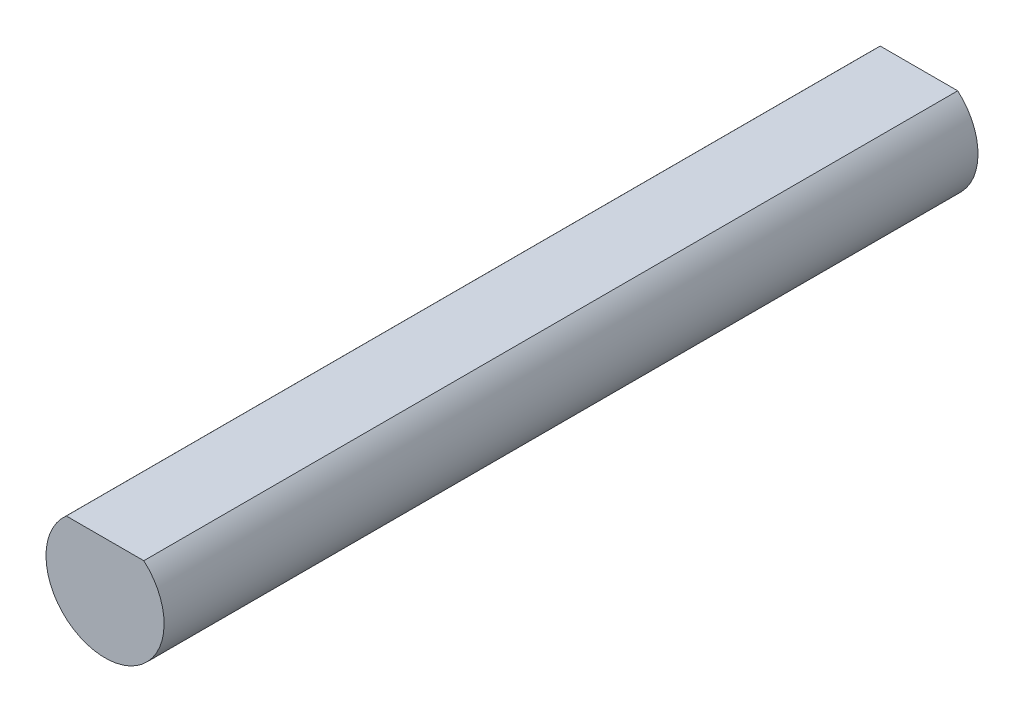
ISO-10303-21;
HEADER;
FILE_DESCRIPTION(('STEP AP214'),'2;1');
FILE_NAME('part.step','',(''),(''),'','','');
FILE_SCHEMA(('AUTOMOTIVE_DESIGN { 1 0 10303 214 1 1 1 1 }'));
ENDSEC;
DATA;
#1=APPLICATION_CONTEXT('core data for automotive mechanical design processes');
#2=APPLICATION_PROTOCOL_DEFINITION('international standard','automotive_design',2000,#1);
#3=PRODUCT_CONTEXT('',#1,'mechanical');
#4=PRODUCT('Part','Part','',(#3));
#5=PRODUCT_RELATED_PRODUCT_CATEGORY('part','',(#4));
#6=PRODUCT_DEFINITION_FORMATION('','',#4);
#7=PRODUCT_DEFINITION_CONTEXT('part definition',#1,'design');
#8=PRODUCT_DEFINITION('design','',#6,#7);
#9=PRODUCT_DEFINITION_SHAPE('','',#8);
#10=(LENGTH_UNIT() NAMED_UNIT(*) SI_UNIT(.MILLI.,.METRE.));
#11=(NAMED_UNIT(*) PLANE_ANGLE_UNIT() SI_UNIT($,.RADIAN.));
#12=(NAMED_UNIT(*) SI_UNIT($,.STERADIAN.) SOLID_ANGLE_UNIT());
#13=UNCERTAINTY_MEASURE_WITH_UNIT(LENGTH_MEASURE(1.E-05),#10,'distance_accuracy_value','');
#14=(GEOMETRIC_REPRESENTATION_CONTEXT(3) GLOBAL_UNCERTAINTY_ASSIGNED_CONTEXT((#13)) GLOBAL_UNIT_ASSIGNED_CONTEXT((#10,
#11,#12)) REPRESENTATION_CONTEXT('',''));
#15=CARTESIAN_POINT('',(0.,0.,0.));
#16=DIRECTION('',(0.,0.,1.));
#17=DIRECTION('',(1.,0.,0.));
#18=AXIS2_PLACEMENT_3D('',#15,#16,#17);
#19=CARTESIAN_POINT('',(0.,0.,27.5));
#20=DIRECTION('',(0.,0.,-1.));
#21=DIRECTION('',(-1.,0.,0.));
#22=AXIS2_PLACEMENT_3D('',#19,#20,#21);
#23=CYLINDRICAL_SURFACE('',#22,3.99);
#24=CARTESIAN_POINT('',(0.,0.,-27.5));
#25=DIRECTION('',(0.,0.,1.));
#26=DIRECTION('',(1.,0.,0.));
#27=AXIS2_PLACEMENT_3D('',#24,#25,#26);
#28=CIRCLE('',#27,3.99);
#29=CARTESIAN_POINT('',(-2.61916017074176,3.01,-27.5));
#30=VERTEX_POINT('',#29);
#31=CARTESIAN_POINT('',(2.61916017074176,3.01,-27.5));
#32=VERTEX_POINT('',#31);
#33=EDGE_CURVE('E64',#30,#32,#28,.T.);
#34=ORIENTED_EDGE('',*,*,#33,.T.);
#35=DIRECTION('',(0.,0.,-1.));
#36=VECTOR('',#35,1.);
#37=CARTESIAN_POINT('',(2.61916017074176,3.01,27.5));
#38=LINE('',#37,#36);
#39=CARTESIAN_POINT('',(2.61916017074176,3.01,27.5));
#40=VERTEX_POINT('',#39);
#41=EDGE_CURVE('E11',#40,#32,#38,.T.);
#42=ORIENTED_EDGE('',*,*,#41,.F.);
#43=CARTESIAN_POINT('',(0.,0.,27.5));
#44=DIRECTION('',(0.,0.,1.));
#45=DIRECTION('',(1.,0.,0.));
#46=AXIS2_PLACEMENT_3D('',#43,#44,#45);
#47=CIRCLE('',#46,3.99);
#48=CARTESIAN_POINT('',(-2.61916017074176,3.01,27.5));
#49=VERTEX_POINT('',#48);
#50=EDGE_CURVE('E63',#49,#40,#47,.T.);
#51=ORIENTED_EDGE('',*,*,#50,.F.);
#52=DIRECTION('',(0.,0.,-1.));
#53=VECTOR('',#52,1.);
#54=CARTESIAN_POINT('',(-2.61916017074176,3.01,27.5));
#55=LINE('',#54,#53);
#56=EDGE_CURVE('E41',#49,#30,#55,.T.);
#57=ORIENTED_EDGE('',*,*,#56,.T.);
#58=EDGE_LOOP('',(#34,#42,#51,#57));
#59=FACE_BOUND('',#58,.T.);
#60=ADVANCED_FACE('F33',(#59),#23,.T.);
#61=CARTESIAN_POINT('',(-2.61916017074176,3.01,27.5));
#62=DIRECTION('',(0.,-1.,0.));
#63=DIRECTION('',(0.,0.,-1.));
#64=AXIS2_PLACEMENT_3D('',#61,#62,#63);
#65=PLANE('',#64);
#66=DIRECTION('',(-1.,0.,0.));
#67=VECTOR('',#66,1.);
#68=CARTESIAN_POINT('',(-2.61916017074176,3.01,-27.5));
#69=LINE('',#68,#67);
#70=EDGE_CURVE('E56',#32,#30,#69,.T.);
#71=ORIENTED_EDGE('',*,*,#70,.T.);
#72=ORIENTED_EDGE('',*,*,#56,.F.);
#73=DIRECTION('',(-1.,0.,0.));
#74=VECTOR('',#73,1.);
#75=CARTESIAN_POINT('',(-2.61916017074176,3.01,27.5));
#76=LINE('',#75,#74);
#77=EDGE_CURVE('E48',#40,#49,#76,.T.);
#78=ORIENTED_EDGE('',*,*,#77,.F.);
#79=ORIENTED_EDGE('',*,*,#41,.T.);
#80=EDGE_LOOP('',(#71,#72,#78,#79));
#81=FACE_BOUND('',#80,.T.);
#82=ADVANCED_FACE('F59',(#81),#65,.F.);
#83=CARTESIAN_POINT('',(0.,0.,27.5));
#84=DIRECTION('',(0.,0.,1.));
#85=DIRECTION('',(1.,0.,0.));
#86=AXIS2_PLACEMENT_3D('',#83,#84,#85);
#87=PLANE('',#86);
#88=ORIENTED_EDGE('',*,*,#50,.T.);
#89=ORIENTED_EDGE('',*,*,#77,.T.);
#90=EDGE_LOOP('',(#88,#89));
#91=FACE_BOUND('',#90,.T.);
#92=ADVANCED_FACE('F71',(#91),#87,.T.);
#93=CARTESIAN_POINT('',(0.,0.,-27.5));
#94=DIRECTION('',(0.,0.,1.));
#95=DIRECTION('',(1.,0.,0.));
#96=AXIS2_PLACEMENT_3D('',#93,#94,#95);
#97=PLANE('',#96);
#98=ORIENTED_EDGE('',*,*,#33,.F.);
#99=ORIENTED_EDGE('',*,*,#70,.F.);
#100=EDGE_LOOP('',(#98,#99));
#101=FACE_BOUND('',#100,.T.);
#102=ADVANCED_FACE('F67',(#101),#97,.F.);
#103=CLOSED_SHELL('',(#60,#82,#92,#102));
#104=MANIFOLD_SOLID_BREP('B2',#103);
#105=ADVANCED_BREP_SHAPE_REPRESENTATION('',(#18,#104),#14);
#106=SHAPE_DEFINITION_REPRESENTATION(#9,#105);
ENDSEC;
END-ISO-10303-21;
